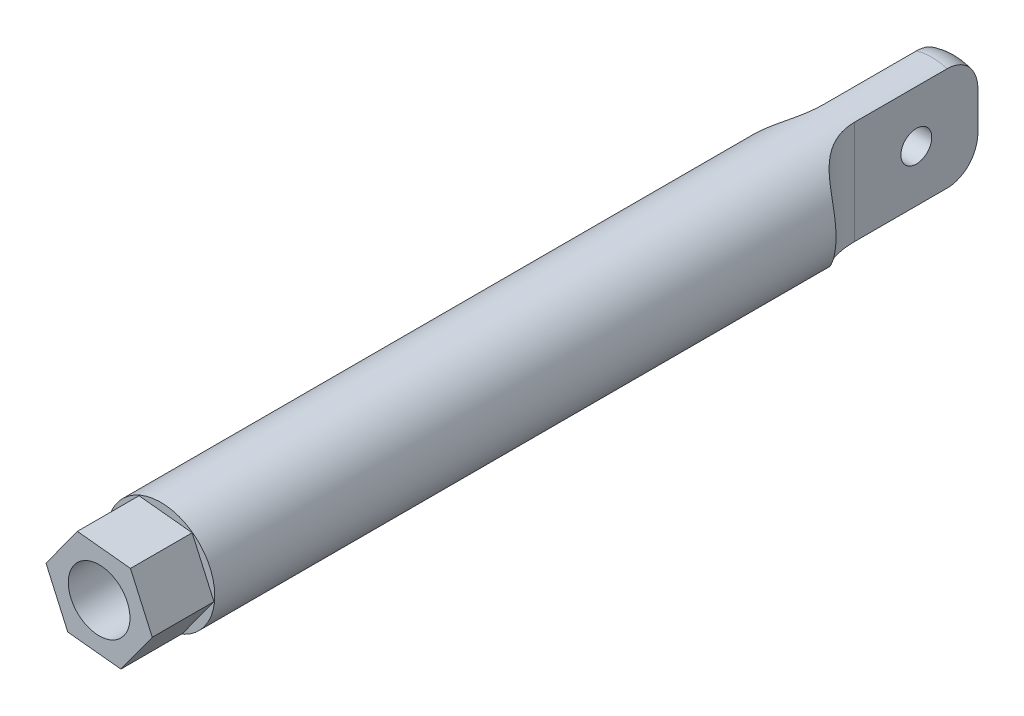
ISO-10303-21;
HEADER;
FILE_DESCRIPTION(('STEP AP214'),'2;1');
FILE_NAME('part.step','',(''),(''),'','','');
FILE_SCHEMA(('AUTOMOTIVE_DESIGN { 1 0 10303 214 1 1 1 1 }'));
ENDSEC;
DATA;
#1=APPLICATION_CONTEXT('core data for automotive mechanical design processes');
#2=APPLICATION_PROTOCOL_DEFINITION('international standard','automotive_design',2000,#1);
#3=PRODUCT_CONTEXT('',#1,'mechanical');
#4=PRODUCT('Part','Part','',(#3));
#5=PRODUCT_RELATED_PRODUCT_CATEGORY('part','',(#4));
#6=PRODUCT_DEFINITION_FORMATION('','',#4);
#7=PRODUCT_DEFINITION_CONTEXT('part definition',#1,'design');
#8=PRODUCT_DEFINITION('design','',#6,#7);
#9=PRODUCT_DEFINITION_SHAPE('','',#8);
#10=(LENGTH_UNIT() NAMED_UNIT(*) SI_UNIT(.MILLI.,.METRE.));
#11=(NAMED_UNIT(*) PLANE_ANGLE_UNIT() SI_UNIT($,.RADIAN.));
#12=(NAMED_UNIT(*) SI_UNIT($,.STERADIAN.) SOLID_ANGLE_UNIT());
#13=UNCERTAINTY_MEASURE_WITH_UNIT(LENGTH_MEASURE(1.E-05),#10,'distance_accuracy_value','');
#14=(GEOMETRIC_REPRESENTATION_CONTEXT(3) GLOBAL_UNCERTAINTY_ASSIGNED_CONTEXT((#13)) GLOBAL_UNIT_ASSIGNED_CONTEXT((#10,
#11,#12)) REPRESENTATION_CONTEXT('',''));
#15=CARTESIAN_POINT('',(0.,0.,0.));
#16=DIRECTION('',(0.,0.,1.));
#17=DIRECTION('',(1.,0.,0.));
#18=AXIS2_PLACEMENT_3D('',#15,#16,#17);
#19=CARTESIAN_POINT('',(0.,0.,20.));
#20=DIRECTION('',(0.,0.,-1.));
#21=DIRECTION('',(-1.,0.,0.));
#22=AXIS2_PLACEMENT_3D('',#19,#20,#21);
#23=CYLINDRICAL_SURFACE('',#22,1.75);
#24=CARTESIAN_POINT('',(0.,0.,20.));
#25=DIRECTION('',(0.,0.,1.));
#26=DIRECTION('',(1.,0.,0.));
#27=AXIS2_PLACEMENT_3D('',#24,#25,#26);
#28=CIRCLE('',#27,1.75);
#29=CARTESIAN_POINT('',(1.75,0.,20.));
#30=VERTEX_POINT('',#29);
#31=EDGE_CURVE('E180',#30,#30,#28,.T.);
#32=ORIENTED_EDGE('',*,*,#31,.F.);
#33=EDGE_LOOP('',(#32));
#34=FACE_BOUND('',#33,.T.);
#35=DIRECTION('',(0.,0.,1.));
#36=VECTOR('',#35,1.);
#37=CARTESIAN_POINT('',(-0.5,-1.67705098312484,-6.));
#38=LINE('',#37,#36);
#39=CARTESIAN_POINT('',(-0.5,-1.67705098312484,-5.));
#40=VERTEX_POINT('',#39);
#41=CARTESIAN_POINT('',(-0.5,-1.67705098312484,-2.));
#42=VERTEX_POINT('',#41);
#43=EDGE_CURVE('E184',#40,#42,#38,.T.);
#44=ORIENTED_EDGE('',*,*,#43,.F.);
#45=CARTESIAN_POINT('',(0.,0.,-5.));
#46=DIRECTION('',(0.,0.,-1.));
#47=DIRECTION('',(-1.,0.,0.));
#48=AXIS2_PLACEMENT_3D('',#45,#46,#47);
#49=CIRCLE('',#48,1.75);
#50=CARTESIAN_POINT('',(0.5,-1.67705098312484,-5.));
#51=VERTEX_POINT('',#50);
#52=EDGE_CURVE('E75',#40,#51,#49,.F.);
#53=ORIENTED_EDGE('',*,*,#52,.T.);
#54=DIRECTION('',(0.,0.,1.));
#55=VECTOR('',#54,1.);
#56=CARTESIAN_POINT('',(0.5,-1.67705098312484,-6.));
#57=LINE('',#56,#55);
#58=CARTESIAN_POINT('',(0.5,-1.67705098312484,-2.));
#59=VERTEX_POINT('',#58);
#60=EDGE_CURVE('E179',#51,#59,#57,.T.);
#61=ORIENTED_EDGE('',*,*,#60,.T.);
#62=CARTESIAN_POINT('',(0.5,-1.67705098312484,-2.));
#63=CARTESIAN_POINT('',(0.499994368760104,-1.6770354956341,-1.94779850562818));
#64=CARTESIAN_POINT('',(0.502043786255566,-1.67644117921669,-1.89559753960627));
#65=CARTESIAN_POINT('',(0.510210741401807,-1.6739827907674,-1.79153500315001));
#66=CARTESIAN_POINT('',(0.516329067705572,-1.67211847257675,-1.73967350048015));
#67=CARTESIAN_POINT('',(0.532626936385553,-1.66699687056864,-1.63642635701448));
#68=CARTESIAN_POINT('',(0.542823897447035,-1.66373360791191,-1.585043737132));
#69=CARTESIAN_POINT('',(0.567169530888582,-1.65559080971641,-1.48337219697433));
#70=CARTESIAN_POINT('',(0.581317980893425,-1.65071136512752,-1.43308321532482));
#71=CARTESIAN_POINT('',(0.629582184733351,-1.63319521188351,-1.28417787664913));
#72=CARTESIAN_POINT('',(0.669493017112604,-1.61768640895561,-1.18767195511259));
#73=CARTESIAN_POINT('',(0.762581856820665,-1.57592622715432,-1.00403868638829));
#74=CARTESIAN_POINT('',(0.815729226293232,-1.54969956767906,-0.916890337305117));
#75=CARTESIAN_POINT('',(0.92711808993018,-1.48551241329525,-0.761254059595936));
#76=CARTESIAN_POINT('',(0.984670484617635,-1.44858916291394,-0.691853392475164));
#77=CARTESIAN_POINT('',(1.10307852981525,-1.36055735206579,-0.566104628248389));
#78=CARTESIAN_POINT('',(1.16393049264598,-1.30946437547285,-0.509742315744062));
#79=CARTESIAN_POINT('',(1.27463269084449,-1.20122198654888,-0.417937641428869));
#80=CARTESIAN_POINT('',(1.32482028315847,-1.14595583221622,-0.380662815132576));
#81=CARTESIAN_POINT('',(1.41981408952918,-1.02590561759596,-0.315804849468108));
#82=CARTESIAN_POINT('',(1.46461876878428,-0.961118854397993,-0.288224469930275));
#83=CARTESIAN_POINT('',(1.54482406578528,-0.825850281714614,-0.242239046746777));
#84=CARTESIAN_POINT('',(1.58046132268212,-0.755590346619209,-0.223589328779858));
#85=CARTESIAN_POINT('',(1.64227010096167,-0.609694301766643,-0.192932414466813));
#86=CARTESIAN_POINT('',(1.66844247834643,-0.534058678926419,-0.18092461737448));
#87=CARTESIAN_POINT('',(1.7093649040377,-0.382690513207061,-0.162780526718146));
#88=CARTESIAN_POINT('',(1.72456317988895,-0.307105951910005,-0.156411079550968));
#89=CARTESIAN_POINT('',(1.74488277767862,-0.154353416992535,-0.147996366695973));
#90=CARTESIAN_POINT('',(1.75000191284764,-0.0771851034300754,-0.145952039378574));
#91=CARTESIAN_POINT('',(1.74999780045129,0.0887537466603745,-0.145948468096598));
#92=CARTESIAN_POINT('',(1.74322440688529,0.177529693356911,-0.148647428740008));
#93=CARTESIAN_POINT('',(1.71637710716438,0.352713049713646,-0.159852537199496));
#94=CARTESIAN_POINT('',(1.69629729938487,0.43911939069674,-0.168361261797137));
#95=CARTESIAN_POINT('',(1.64363349655238,0.60723728009681,-0.192384662048259));
#96=CARTESIAN_POINT('',(1.61102414659559,0.688938920017352,-0.20791355510727));
#97=CARTESIAN_POINT('',(1.53500808753283,0.844841115620229,-0.247681905645829));
#98=CARTESIAN_POINT('',(1.49160842487803,0.91904652230522,-0.271915683107096));
#99=CARTESIAN_POINT('',(1.39864086033547,1.05490115063262,-0.329708579575449));
#100=CARTESIAN_POINT('',(1.34937461732014,1.11692368829345,-0.362872925986087));
#101=CARTESIAN_POINT('',(1.24697649709225,1.2301938824324,-0.43986698868439));
#102=CARTESIAN_POINT('',(1.19384645814268,1.28144661825437,-0.483691656124972));
#103=CARTESIAN_POINT('',(1.09104439951398,1.3698342474073,-0.578928156800576));
#104=CARTESIAN_POINT('',(1.04136107424774,1.40764457907203,-0.629705891103311));
#105=CARTESIAN_POINT('',(0.945288575693474,1.47388681455344,-0.739758104881316));
#106=CARTESIAN_POINT('',(0.898900251817218,1.50231630693835,-0.799034763475127));
#107=CARTESIAN_POINT('',(0.810061105244946,1.55209958243672,-0.927405132603375));
#108=CARTESIAN_POINT('',(0.767864591295967,1.57309747597833,-0.996810911116874));
#109=CARTESIAN_POINT('',(0.691690417619834,1.60804998747918,-1.14167108282463));
#110=CARTESIAN_POINT('',(0.657719965290688,1.62199844050285,-1.21713070369136));
#111=CARTESIAN_POINT('',(0.595217433162131,1.64605425240302,-1.38299400372385));
#112=CARTESIAN_POINT('',(0.568064668084726,1.65537531544644,-1.47403000988998));
#113=CARTESIAN_POINT('',(0.526949208013219,1.66892079092357,-1.65931931681658));
#114=CARTESIAN_POINT('',(0.51297225282159,1.67315071488033,-1.75356902459996));
#115=CARTESIAN_POINT('',(0.503841035168636,1.67590085139054,-1.87353036390101));
#116=CARTESIAN_POINT('',(0.502399877054088,1.67633345115781,-1.89882132691853));
#117=CARTESIAN_POINT('',(0.500480538421314,1.67690839350984,-1.94940570526943));
#118=CARTESIAN_POINT('',(0.50000093999845,1.67705116347812,-1.97469906190988));
#119=CARTESIAN_POINT('',(0.5,1.67705098312484,-2.));
#120=B_SPLINE_CURVE_WITH_KNOTS('',3,(#62,#63,#64,#65,#66,#67,#68,#69,#70,#71,#72,#73,#74,#75,
#76,#77,#78,#79,#80,#81,#82,#83,#84,#85,#86,#87,#88,#89,#90,#91,#92,#93,#94,#95,#96,#97,#98,#99,
#100,#101,#102,#103,#104,#105,#106,#107,#108,#109,#110,#111,#112,#113,#114,#115,#116,#117,#118,
#119),.UNSPECIFIED.,.F.,.F.,(4,2,2,2,2,2,2,2,2,2,2,2,2,2,2,2,2,2,2,2,2,2,2,2,2,2,2,2,4),(0.,
0.156559424932146,0.31314920371672,0.470414997749555,0.627671943226262,0.942632539499827,
1.25687078175179,1.54734717332285,1.83750535708071,2.08655984327701,2.33568517338147,
2.57752712946928,2.81934720793962,3.05062481360145,3.2819525917036,3.54795219655979,
3.81406985586601,4.08072889403875,4.34721424983615,4.60344405257125,4.85955273748294,
5.0998765655702,5.34026212308676,5.59096071927434,5.84187818075049,6.12711457922296,
6.41204191030366,6.48803673525265,6.56391941646192),.UNSPECIFIED.);
#121=CARTESIAN_POINT('',(0.5,1.67705098312484,-2.));
#122=VERTEX_POINT('',#121);
#123=EDGE_CURVE('E50',#59,#122,#120,.T.);
#124=ORIENTED_EDGE('',*,*,#123,.T.);
#125=DIRECTION('',(0.,0.,1.));
#126=VECTOR('',#125,1.);
#127=CARTESIAN_POINT('',(0.5,1.67705098312484,-6.));
#128=LINE('',#127,#126);
#129=CARTESIAN_POINT('',(0.5,1.67705098312484,-5.));
#130=VERTEX_POINT('',#129);
#131=EDGE_CURVE('E193',#130,#122,#128,.T.);
#132=ORIENTED_EDGE('',*,*,#131,.F.);
#133=CARTESIAN_POINT('',(0.,0.,-5.));
#134=DIRECTION('',(0.,0.,-1.));
#135=DIRECTION('',(-1.,0.,0.));
#136=AXIS2_PLACEMENT_3D('',#133,#134,#135);
#137=CIRCLE('',#136,1.75);
#138=CARTESIAN_POINT('',(-0.499999999999999,1.67705098312484,-5.));
#139=VERTEX_POINT('',#138);
#140=EDGE_CURVE('E265',#130,#139,#137,.F.);
#141=ORIENTED_EDGE('',*,*,#140,.T.);
#142=DIRECTION('',(0.,0.,1.));
#143=VECTOR('',#142,1.);
#144=CARTESIAN_POINT('',(-0.499999999999999,1.67705098312484,-6.));
#145=LINE('',#144,#143);
#146=CARTESIAN_POINT('',(-0.5,1.67705098312484,-2.));
#147=VERTEX_POINT('',#146);
#148=EDGE_CURVE('E190',#139,#147,#145,.T.);
#149=ORIENTED_EDGE('',*,*,#148,.T.);
#150=CARTESIAN_POINT('',(-0.5,1.67705098312484,-2.));
#151=CARTESIAN_POINT('',(-0.499994368760104,1.6770354956341,-1.94779850562818));
#152=CARTESIAN_POINT('',(-0.502043786255566,1.67644117921669,-1.89559753960627));
#153=CARTESIAN_POINT('',(-0.510210741401807,1.6739827907674,-1.79153500315001));
#154=CARTESIAN_POINT('',(-0.516329067705572,1.67211847257675,-1.73967350048015));
#155=CARTESIAN_POINT('',(-0.532626936385553,1.66699687056864,-1.63642635701448));
#156=CARTESIAN_POINT('',(-0.542823897447035,1.66373360791191,-1.585043737132));
#157=CARTESIAN_POINT('',(-0.567169530888582,1.65559080971641,-1.48337219697433));
#158=CARTESIAN_POINT('',(-0.581317980893425,1.65071136512752,-1.43308321532482));
#159=CARTESIAN_POINT('',(-0.629582184733351,1.63319521188351,-1.28417787664913));
#160=CARTESIAN_POINT('',(-0.669493017112604,1.61768640895561,-1.18767195511259));
#161=CARTESIAN_POINT('',(-0.762581856820665,1.57592622715432,-1.00403868638829));
#162=CARTESIAN_POINT('',(-0.815729226293232,1.54969956767906,-0.916890337305117));
#163=CARTESIAN_POINT('',(-0.92711808993018,1.48551241329525,-0.761254059595936));
#164=CARTESIAN_POINT('',(-0.984670484617635,1.44858916291394,-0.691853392475164));
#165=CARTESIAN_POINT('',(-1.10307852981525,1.36055735206579,-0.566104628248389));
#166=CARTESIAN_POINT('',(-1.16393049264598,1.30946437547285,-0.509742315744062));
#167=CARTESIAN_POINT('',(-1.27463269084449,1.20122198654888,-0.417937641428869));
#168=CARTESIAN_POINT('',(-1.32482028315847,1.14595583221622,-0.380662815132576));
#169=CARTESIAN_POINT('',(-1.41981408952918,1.02590561759596,-0.315804849468108));
#170=CARTESIAN_POINT('',(-1.46461876878428,0.961118854397993,-0.288224469930275));
#171=CARTESIAN_POINT('',(-1.54482406578528,0.825850281714614,-0.242239046746777));
#172=CARTESIAN_POINT('',(-1.58046132268212,0.755590346619209,-0.223589328779858));
#173=CARTESIAN_POINT('',(-1.64227010096167,0.609694301766643,-0.192932414466813));
#174=CARTESIAN_POINT('',(-1.66844247834643,0.534058678926419,-0.18092461737448));
#175=CARTESIAN_POINT('',(-1.7093649040377,0.382690513207061,-0.162780526718146));
#176=CARTESIAN_POINT('',(-1.72456317988895,0.307105951910005,-0.156411079550968));
#177=CARTESIAN_POINT('',(-1.74488277767862,0.154353416992535,-0.147996366695973));
#178=CARTESIAN_POINT('',(-1.75000191284764,0.0771851034300755,-0.145952039378574));
#179=CARTESIAN_POINT('',(-1.74999780045129,-0.0887537466603742,-0.145948468096598));
#180=CARTESIAN_POINT('',(-1.74322440688529,-0.177529693356911,-0.148647428740008));
#181=CARTESIAN_POINT('',(-1.71637710716438,-0.352713049713646,-0.159852537199496));
#182=CARTESIAN_POINT('',(-1.69629729938487,-0.43911939069674,-0.168361261797137));
#183=CARTESIAN_POINT('',(-1.64363349655238,-0.60723728009681,-0.192384662048259));
#184=CARTESIAN_POINT('',(-1.61102414659559,-0.688938920017352,-0.20791355510727));
#185=CARTESIAN_POINT('',(-1.53500808753283,-0.844841115620229,-0.247681905645829));
#186=CARTESIAN_POINT('',(-1.49160842487803,-0.91904652230522,-0.271915683107097));
#187=CARTESIAN_POINT('',(-1.39864086033547,-1.05490115063262,-0.329708579575449));
#188=CARTESIAN_POINT('',(-1.34937461732014,-1.11692368829345,-0.362872925986087));
#189=CARTESIAN_POINT('',(-1.24697649709225,-1.2301938824324,-0.43986698868439));
#190=CARTESIAN_POINT('',(-1.19384645814268,-1.28144661825437,-0.483691656124972));
#191=CARTESIAN_POINT('',(-1.09104439951398,-1.3698342474073,-0.578928156800576));
#192=CARTESIAN_POINT('',(-1.04136107424774,-1.40764457907203,-0.629705891103311));
#193=CARTESIAN_POINT('',(-0.945288575693474,-1.47388681455344,-0.739758104881316));
#194=CARTESIAN_POINT('',(-0.898900251817219,-1.50231630693835,-0.799034763475127));
#195=CARTESIAN_POINT('',(-0.810061105244946,-1.55209958243672,-0.927405132603375));
#196=CARTESIAN_POINT('',(-0.767864591295967,-1.57309747597833,-0.996810911116873));
#197=CARTESIAN_POINT('',(-0.691690417619834,-1.60804998747918,-1.14167108282463));
#198=CARTESIAN_POINT('',(-0.657719965290688,-1.62199844050285,-1.21713070369136));
#199=CARTESIAN_POINT('',(-0.595217433162131,-1.64605425240302,-1.38299400372385));
#200=CARTESIAN_POINT('',(-0.568064668084726,-1.65537531544644,-1.47403000988998));
#201=CARTESIAN_POINT('',(-0.526949208013218,-1.66892079092357,-1.65931931681658));
#202=CARTESIAN_POINT('',(-0.51297225282159,-1.67315071488033,-1.75356902459996));
#203=CARTESIAN_POINT('',(-0.503841035168636,-1.67590085139054,-1.87353036390101));
#204=CARTESIAN_POINT('',(-0.502399877054088,-1.67633345115781,-1.89882132691853));
#205=CARTESIAN_POINT('',(-0.500480538421314,-1.67690839350984,-1.94940570526943));
#206=CARTESIAN_POINT('',(-0.50000093999845,-1.67705116347812,-1.97469906190988));
#207=CARTESIAN_POINT('',(-0.499999999999999,-1.67705098312484,-2.));
#208=B_SPLINE_CURVE_WITH_KNOTS('',3,(#150,#151,#152,#153,#154,#155,#156,#157,#158,#159,#160,
#161,#162,#163,#164,#165,#166,#167,#168,#169,#170,#171,#172,#173,#174,#175,#176,#177,#178,#179,
#180,#181,#182,#183,#184,#185,#186,#187,#188,#189,#190,#191,#192,#193,#194,#195,#196,#197,#198,
#199,#200,#201,#202,#203,#204,#205,#206,#207),.UNSPECIFIED.,.F.,.F.,(4,2,2,2,2,2,2,2,2,2,2,2,2,
2,2,2,2,2,2,2,2,2,2,2,2,2,2,2,4),(0.,0.156559424932146,0.31314920371672,0.470414997749555,
0.627671943226262,0.942632539499827,1.25687078175179,1.54734717332285,1.83750535708071,
2.08655984327701,2.33568517338147,2.57752712946928,2.81934720793962,3.05062481360145,
3.2819525917036,3.54795219655979,3.81406985586601,4.08072889403875,4.34721424983615,
4.60344405257125,4.85955273748294,5.0998765655702,5.34026212308676,5.59096071927434,
5.84187818075049,6.12711457922296,6.41204191030366,6.48803673525265,6.56391941646192),.UNSPECIFIED.);
#209=EDGE_CURVE('E11',#147,#42,#208,.T.);
#210=ORIENTED_EDGE('',*,*,#209,.T.);
#211=EDGE_LOOP('',(#44,#53,#61,#124,#132,#141,#149,#210));
#212=FACE_BOUND('',#211,.T.);
#213=ADVANCED_FACE('F36',(#34,#212),#23,.T.);
#214=CARTESIAN_POINT('',(0.,0.,20.));
#215=DIRECTION('',(0.,0.,1.));
#216=DIRECTION('',(1.,0.,0.));
#217=AXIS2_PLACEMENT_3D('',#214,#215,#216);
#218=PLANE('',#217);
#219=DIRECTION('',(0.587086788703137,0.809523997501147,0.));
#220=VECTOR('',#219,1.);
#221=CARTESIAN_POINT('',(0.705853923008576,-1.58169852986383,20.));
#222=LINE('',#221,#220);
#223=CARTESIAN_POINT('',(0.705853923008576,-1.58169852986383,20.));
#224=VERTEX_POINT('',#223);
#225=CARTESIAN_POINT('',(1.72271806949487,-0.179561836245582,20.));
#226=VERTEX_POINT('',#225);
#227=EDGE_CURVE('E458',#224,#226,#222,.T.);
#228=ORIENTED_EDGE('',*,*,#227,.F.);
#229=DIRECTION('',(0.994611741160693,-0.10367007449257,0.));
#230=VECTOR('',#229,1.);
#231=CARTESIAN_POINT('',(-1.01686414648629,-1.40213669361825,20.));
#232=LINE('',#231,#230);
#233=CARTESIAN_POINT('',(-1.01686414648629,-1.40213669361825,20.));
#234=VERTEX_POINT('',#233);
#235=EDGE_CURVE('E160',#234,#224,#232,.T.);
#236=ORIENTED_EDGE('',*,*,#235,.F.);
#237=DIRECTION('',(0.407524952457555,-0.913194071993718,0.));
#238=VECTOR('',#237,1.);
#239=CARTESIAN_POINT('',(-1.72271806949487,0.179561836245582,20.));
#240=LINE('',#239,#238);
#241=CARTESIAN_POINT('',(-1.72271806949487,0.179561836245582,20.));
#242=VERTEX_POINT('',#241);
#243=EDGE_CURVE('E156',#242,#234,#240,.T.);
#244=ORIENTED_EDGE('',*,*,#243,.F.);
#245=DIRECTION('',(-0.587086788703137,-0.809523997501148,0.));
#246=VECTOR('',#245,1.);
#247=CARTESIAN_POINT('',(-0.705853923008577,1.58169852986383,20.));
#248=LINE('',#247,#246);
#249=CARTESIAN_POINT('',(-0.705853923008577,1.58169852986383,20.));
#250=VERTEX_POINT('',#249);
#251=EDGE_CURVE('E468',#250,#242,#248,.T.);
#252=ORIENTED_EDGE('',*,*,#251,.F.);
#253=DIRECTION('',(-0.994611741160693,0.10367007449257,0.));
#254=VECTOR('',#253,1.);
#255=CARTESIAN_POINT('',(1.01686414648629,1.40213669361825,20.));
#256=LINE('',#255,#254);
#257=CARTESIAN_POINT('',(1.01686414648629,1.40213669361825,20.));
#258=VERTEX_POINT('',#257);
#259=EDGE_CURVE('E457',#258,#250,#256,.T.);
#260=ORIENTED_EDGE('',*,*,#259,.F.);
#261=DIRECTION('',(-0.407524952457556,0.913194071993718,0.));
#262=VECTOR('',#261,1.);
#263=CARTESIAN_POINT('',(1.72271806949487,-0.179561836245582,20.));
#264=LINE('',#263,#262);
#265=EDGE_CURVE('E453',#226,#258,#264,.T.);
#266=ORIENTED_EDGE('',*,*,#265,.F.);
#267=EDGE_LOOP('',(#228,#236,#244,#252,#260,#266));
#268=FACE_BOUND('',#267,.T.);
#269=ORIENTED_EDGE('',*,*,#31,.T.);
#270=EDGE_LOOP('',(#269));
#271=FACE_BOUND('',#270,.T.);
#272=ADVANCED_FACE('F220',(#268,#271),#218,.T.);
#273=CARTESIAN_POINT('',(-0.5,1.67705098312484,-6.));
#274=DIRECTION('',(1.,0.,0.));
#275=DIRECTION('',(0.,0.,-1.));
#276=AXIS2_PLACEMENT_3D('',#273,#274,#275);
#277=PLANE('',#276);
#278=CARTESIAN_POINT('',(-0.5,0.,-4.));
#279=DIRECTION('',(1.,0.,0.));
#280=DIRECTION('',(0.,0.,-1.));
#281=AXIS2_PLACEMENT_3D('',#278,#279,#280);
#282=CIRCLE('',#281,0.5);
#283=CARTESIAN_POINT('',(-0.5,0.,-4.5));
#284=VERTEX_POINT('',#283);
#285=EDGE_CURVE('E165',#284,#284,#282,.T.);
#286=ORIENTED_EDGE('',*,*,#285,.T.);
#287=EDGE_LOOP('',(#286));
#288=FACE_BOUND('',#287,.T.);
#289=ORIENTED_EDGE('',*,*,#43,.T.);
#290=DIRECTION('',(0.,1.,0.));
#291=VECTOR('',#290,1.);
#292=CARTESIAN_POINT('',(-0.5,1.67705098312484,-2.));
#293=LINE('',#292,#291);
#294=EDGE_CURVE('E238',#42,#147,#293,.T.);
#295=ORIENTED_EDGE('',*,*,#294,.T.);
#296=ORIENTED_EDGE('',*,*,#148,.F.);
#297=CARTESIAN_POINT('',(-0.499999999999999,1.67705098312484,-5.));
#298=CARTESIAN_POINT('',(-0.5,1.67705105514918,-5.02712221675765));
#299=CARTESIAN_POINT('',(-0.5,1.67589881450192,-5.05423130306363));
#300=CARTESIAN_POINT('',(-0.5,1.67130383903263,-5.10825230592725));
#301=CARTESIAN_POINT('',(-0.5,1.6678613008873,-5.13516423921458));
#302=CARTESIAN_POINT('',(-0.5,1.65414165250946,-5.2152235947678));
#303=CARTESIAN_POINT('',(-0.5,1.64047234325635,-5.26782954038159));
#304=CARTESIAN_POINT('',(-0.5,1.60450833746373,-5.36998873193024));
#305=CARTESIAN_POINT('',(-0.5,1.58221113848202,-5.41954108736036));
#306=CARTESIAN_POINT('',(-0.5,1.52968242645123,-5.51425796582973));
#307=CARTESIAN_POINT('',(-0.5,1.49944949912221,-5.55942170477607));
#308=CARTESIAN_POINT('',(-0.5,1.43166003567242,-5.64456928803723));
#309=CARTESIAN_POINT('',(-0.5,1.39403638843814,-5.684499609823));
#310=CARTESIAN_POINT('',(-0.5,1.31282823180818,-5.75768858177214));
#311=CARTESIAN_POINT('',(-0.5,1.26924659166248,-5.79095042443848));
#312=CARTESIAN_POINT('',(-0.5,1.17590617534478,-5.8511338045389));
#313=CARTESIAN_POINT('',(-0.5,1.1259929953532,-5.8778149614399));
#314=CARTESIAN_POINT('',(-0.5,1.02253057080096,-5.92312201997402));
#315=CARTESIAN_POINT('',(-0.5,0.968974440489841,-5.94173214744525));
#316=CARTESIAN_POINT('',(-0.5,0.885429793156453,-5.96413279272261));
#317=CARTESIAN_POINT('',(-0.5,0.856167447071508,-5.97078029204757));
#318=CARTESIAN_POINT('',(-0.5,0.797223172545375,-5.98194478378622));
#319=CARTESIAN_POINT('',(-0.5,0.7675410848163,-5.98646094374436));
#320=CARTESIAN_POINT('',(-0.5,0.70808151016266,-5.99348074467713));
#321=CARTESIAN_POINT('',(-0.5,0.678305030017304,-5.99599322157477));
#322=CARTESIAN_POINT('',(-0.5,0.618686576752835,-5.99925816773273));
#323=CARTESIAN_POINT('',(-0.5,0.588844712631542,-6.00001258234323));
#324=CARTESIAN_POINT('',(-0.5,0.559016994374948,-6.));
#325=B_SPLINE_CURVE_WITH_KNOTS('',3,(#297,#298,#299,#300,#301,#302,#303,#304,#305,#306,#307,
#308,#309,#310,#311,#312,#313,#314,#315,#316,#317,#318,#319,#320,#321,#322,#323,#324),
.UNSPECIFIED.,.F.,.F.,(4,2,2,2,2,2,2,2,2,2,2,2,2,4),(0.,0.0813161732522054,0.162625364471296,
0.324844050045972,0.487109821007945,0.649404530110584,0.813247420871931,0.977011684322015,
1.14608263644568,1.3154825508234,1.40543948553437,1.49543152647952,1.58502448782152,
1.67451826461537),.UNSPECIFIED.);
#326=CARTESIAN_POINT('',(-0.5,0.559016994374948,-6.));
#327=VERTEX_POINT('',#326);
#328=EDGE_CURVE('E197',#139,#327,#325,.T.);
#329=ORIENTED_EDGE('',*,*,#328,.T.);
#330=DIRECTION('',(0.,1.,0.));
#331=VECTOR('',#330,1.);
#332=CARTESIAN_POINT('',(-0.5,1.67705098312484,-6.));
#333=LINE('',#332,#331);
#334=CARTESIAN_POINT('',(-0.5,-0.559016994374947,-6.));
#335=VERTEX_POINT('',#334);
#336=EDGE_CURVE('E173',#335,#327,#333,.T.);
#337=ORIENTED_EDGE('',*,*,#336,.F.);
#338=CARTESIAN_POINT('',(-0.5,-0.559016994374948,-6.));
#339=CARTESIAN_POINT('',(-0.5,-0.590523370220473,-6.0000155087921));
#340=CARTESIAN_POINT('',(-0.5,-0.622047209207892,-5.99917221406143));
#341=CARTESIAN_POINT('',(-0.5,-0.685017542584036,-5.99551160620083));
#342=CARTESIAN_POINT('',(-0.5,-0.716463887666625,-5.99269178450116));
#343=CARTESIAN_POINT('',(-0.5,-0.779238988183232,-5.98480115354807));
#344=CARTESIAN_POINT('',(-0.5,-0.810566419238076,-5.979719417905));
#345=CARTESIAN_POINT('',(-0.5,-0.872715817030011,-5.96715294432306));
#346=CARTESIAN_POINT('',(-0.5,-0.903538003746205,-5.95966928303451));
#347=CARTESIAN_POINT('',(-0.5,-0.991578636703342,-5.93440466173859));
#348=CARTESIAN_POINT('',(-0.5,-1.04791620546273,-5.91338259910433));
#349=CARTESIAN_POINT('',(-0.5,-1.15618485880326,-5.86227735730488));
#350=CARTESIAN_POINT('',(-0.5,-1.20812498707792,-5.83221338373551));
#351=CARTESIAN_POINT('',(-0.5,-1.30620398582002,-5.76335081830182));
#352=CARTESIAN_POINT('',(-0.5,-1.35231828406257,-5.72451703718384));
#353=CARTESIAN_POINT('',(-0.5,-1.43685094592269,-5.63914846526164));
#354=CARTESIAN_POINT('',(-0.5,-1.47526451057295,-5.59260890512398));
#355=CARTESIAN_POINT('',(-0.5,-1.54077647896141,-5.49643155279105));
#356=CARTESIAN_POINT('',(-0.5,-1.56843639771522,-5.44717522253561));
#357=CARTESIAN_POINT('',(-0.5,-1.61476960827332,-5.34462967273246));
#358=CARTESIAN_POINT('',(-0.5,-1.63345117457977,-5.2913442190781));
#359=CARTESIAN_POINT('',(-0.5,-1.65718931163361,-5.19818965111167));
#360=CARTESIAN_POINT('',(-0.5,-1.66462580305358,-5.15890980002616));
#361=CARTESIAN_POINT('',(-0.5,-1.67455993536413,-5.07975962250253));
#362=CARTESIAN_POINT('',(-0.5,-1.67706112351549,-5.03988974093176));
#363=CARTESIAN_POINT('',(-0.5,-1.67705098312484,-5.));
#364=B_SPLINE_CURVE_WITH_KNOTS('',3,(#338,#339,#340,#341,#342,#343,#344,#345,#346,#347,#348,
#349,#350,#351,#352,#353,#354,#355,#356,#357,#358,#359,#360,#361,#362,#363),.UNSPECIFIED.,.F.,
.F.,(4,2,2,2,2,2,2,2,2,2,2,2,4),(0.,0.0945327228286313,0.189185642515109,0.284300839779262,
0.379373461570003,0.558924560141508,0.738096942324794,0.918001455223145,1.09801773542514,
1.26666172786712,1.43514999755029,1.55478924419672,1.67434246848618),.UNSPECIFIED.);
#365=EDGE_CURVE('E205',#335,#40,#364,.T.);
#366=ORIENTED_EDGE('',*,*,#365,.T.);
#367=EDGE_LOOP('',(#289,#295,#296,#329,#337,#366));
#368=FACE_BOUND('',#367,.T.);
#369=ADVANCED_FACE('F214',(#288,#368),#277,.F.);
#370=CARTESIAN_POINT('',(0.5,1.67705098312484,-6.));
#371=DIRECTION('',(-1.,0.,0.));
#372=DIRECTION('',(0.,0.,1.));
#373=AXIS2_PLACEMENT_3D('',#370,#371,#372);
#374=PLANE('',#373);
#375=CARTESIAN_POINT('',(0.5,0.,-4.));
#376=DIRECTION('',(-1.,0.,0.));
#377=DIRECTION('',(0.,0.,1.));
#378=AXIS2_PLACEMENT_3D('',#375,#376,#377);
#379=CIRCLE('',#378,0.5);
#380=CARTESIAN_POINT('',(0.5,0.,-3.5));
#381=VERTEX_POINT('',#380);
#382=EDGE_CURVE('E162',#381,#381,#379,.T.);
#383=ORIENTED_EDGE('',*,*,#382,.T.);
#384=EDGE_LOOP('',(#383));
#385=FACE_BOUND('',#384,.T.);
#386=ORIENTED_EDGE('',*,*,#131,.T.);
#387=DIRECTION('',(0.,-1.,0.));
#388=VECTOR('',#387,1.);
#389=CARTESIAN_POINT('',(0.5,-1.67705098312484,-2.));
#390=LINE('',#389,#388);
#391=EDGE_CURVE('E248',#122,#59,#390,.T.);
#392=ORIENTED_EDGE('',*,*,#391,.T.);
#393=ORIENTED_EDGE('',*,*,#60,.F.);
#394=CARTESIAN_POINT('',(0.5,-1.67705098312484,-5.));
#395=CARTESIAN_POINT('',(0.5,-1.67705105514918,-5.02712221675765));
#396=CARTESIAN_POINT('',(0.5,-1.67589881450192,-5.05423130306363));
#397=CARTESIAN_POINT('',(0.5,-1.67130383903263,-5.10825230592725));
#398=CARTESIAN_POINT('',(0.5,-1.6678613008873,-5.13516423921458));
#399=CARTESIAN_POINT('',(0.5,-1.65414165250946,-5.2152235947678));
#400=CARTESIAN_POINT('',(0.5,-1.64047234325635,-5.26782954038159));
#401=CARTESIAN_POINT('',(0.5,-1.60450833746373,-5.36998873193024));
#402=CARTESIAN_POINT('',(0.5,-1.58221113848202,-5.41954108736036));
#403=CARTESIAN_POINT('',(0.5,-1.52968242645123,-5.51425796582973));
#404=CARTESIAN_POINT('',(0.5,-1.49944949912221,-5.55942170477607));
#405=CARTESIAN_POINT('',(0.5,-1.43166003567242,-5.64456928803723));
#406=CARTESIAN_POINT('',(0.5,-1.39403638843814,-5.684499609823));
#407=CARTESIAN_POINT('',(0.5,-1.31282823180818,-5.75768858177214));
#408=CARTESIAN_POINT('',(0.5,-1.26924659166248,-5.79095042443848));
#409=CARTESIAN_POINT('',(0.5,-1.17590617534478,-5.8511338045389));
#410=CARTESIAN_POINT('',(0.5,-1.1259929953532,-5.8778149614399));
#411=CARTESIAN_POINT('',(0.5,-1.02253057080096,-5.92312201997402));
#412=CARTESIAN_POINT('',(0.5,-0.968974440489841,-5.94173214744525));
#413=CARTESIAN_POINT('',(0.5,-0.885429793156453,-5.96413279272261));
#414=CARTESIAN_POINT('',(0.5,-0.856167447071508,-5.97078029204757));
#415=CARTESIAN_POINT('',(0.5,-0.797223172545375,-5.98194478378622));
#416=CARTESIAN_POINT('',(0.5,-0.7675410848163,-5.98646094374436));
#417=CARTESIAN_POINT('',(0.5,-0.70808151016266,-5.99348074467713));
#418=CARTESIAN_POINT('',(0.5,-0.678305030017304,-5.99599322157477));
#419=CARTESIAN_POINT('',(0.5,-0.618686576752835,-5.99925816773273));
#420=CARTESIAN_POINT('',(0.5,-0.588844712631542,-6.00001258234323));
#421=CARTESIAN_POINT('',(0.5,-0.559016994374948,-6.));
#422=B_SPLINE_CURVE_WITH_KNOTS('',3,(#394,#395,#396,#397,#398,#399,#400,#401,#402,#403,#404,
#405,#406,#407,#408,#409,#410,#411,#412,#413,#414,#415,#416,#417,#418,#419,#420,#421),
.UNSPECIFIED.,.F.,.F.,(4,2,2,2,2,2,2,2,2,2,2,2,2,4),(0.,0.0813161732522054,0.162625364471296,
0.324844050045972,0.487109821007945,0.649404530110584,0.813247420871931,0.977011684322015,
1.14608263644568,1.3154825508234,1.40543948553437,1.49543152647952,1.58502448782152,
1.67451826461537),.UNSPECIFIED.);
#423=CARTESIAN_POINT('',(0.5,-0.559016994374947,-6.));
#424=VERTEX_POINT('',#423);
#425=EDGE_CURVE('E251',#51,#424,#422,.T.);
#426=ORIENTED_EDGE('',*,*,#425,.T.);
#427=DIRECTION('',(0.,-1.,0.));
#428=VECTOR('',#427,1.);
#429=CARTESIAN_POINT('',(0.5,1.67705098312484,-6.));
#430=LINE('',#429,#428);
#431=CARTESIAN_POINT('',(0.5,0.559016994374948,-6.));
#432=VERTEX_POINT('',#431);
#433=EDGE_CURVE('E176',#432,#424,#430,.T.);
#434=ORIENTED_EDGE('',*,*,#433,.F.);
#435=CARTESIAN_POINT('',(0.5,0.559016994374948,-6.));
#436=CARTESIAN_POINT('',(0.5,0.590523370220473,-6.0000155087921));
#437=CARTESIAN_POINT('',(0.5,0.622047209207892,-5.99917221406143));
#438=CARTESIAN_POINT('',(0.5,0.685017542584036,-5.99551160620083));
#439=CARTESIAN_POINT('',(0.5,0.716463887666625,-5.99269178450116));
#440=CARTESIAN_POINT('',(0.5,0.779238988183232,-5.98480115354807));
#441=CARTESIAN_POINT('',(0.5,0.810566419238076,-5.979719417905));
#442=CARTESIAN_POINT('',(0.5,0.872715817030011,-5.96715294432306));
#443=CARTESIAN_POINT('',(0.5,0.903538003746205,-5.95966928303451));
#444=CARTESIAN_POINT('',(0.5,0.991578636703342,-5.93440466173859));
#445=CARTESIAN_POINT('',(0.5,1.04791620546273,-5.91338259910433));
#446=CARTESIAN_POINT('',(0.5,1.15618485880326,-5.86227735730488));
#447=CARTESIAN_POINT('',(0.5,1.20812498707792,-5.83221338373551));
#448=CARTESIAN_POINT('',(0.5,1.30620398582002,-5.76335081830182));
#449=CARTESIAN_POINT('',(0.5,1.35231828406257,-5.72451703718384));
#450=CARTESIAN_POINT('',(0.5,1.43685094592269,-5.63914846526164));
#451=CARTESIAN_POINT('',(0.5,1.47526451057295,-5.59260890512398));
#452=CARTESIAN_POINT('',(0.5,1.54077647896141,-5.49643155279105));
#453=CARTESIAN_POINT('',(0.5,1.56843639771522,-5.44717522253561));
#454=CARTESIAN_POINT('',(0.5,1.61476960827332,-5.34462967273246));
#455=CARTESIAN_POINT('',(0.5,1.63345117457977,-5.2913442190781));
#456=CARTESIAN_POINT('',(0.5,1.65718931163361,-5.19818965111167));
#457=CARTESIAN_POINT('',(0.5,1.66462580305358,-5.15890980002616));
#458=CARTESIAN_POINT('',(0.5,1.67455993536413,-5.07975962250253));
#459=CARTESIAN_POINT('',(0.5,1.67706112351549,-5.03988974093176));
#460=CARTESIAN_POINT('',(0.5,1.67705098312484,-5.));
#461=B_SPLINE_CURVE_WITH_KNOTS('',3,(#435,#436,#437,#438,#439,#440,#441,#442,#443,#444,#445,
#446,#447,#448,#449,#450,#451,#452,#453,#454,#455,#456,#457,#458,#459,#460),.UNSPECIFIED.,.F.,
.F.,(4,2,2,2,2,2,2,2,2,2,2,2,4),(0.,0.0945327228286313,0.189185642515109,0.284300839779262,
0.379373461570003,0.558924560141508,0.738096942324794,0.918001455223145,1.09801773542514,
1.26666172786712,1.43514999755029,1.55478924419672,1.67434246848618),.UNSPECIFIED.);
#462=EDGE_CURVE('E252',#432,#130,#461,.T.);
#463=ORIENTED_EDGE('',*,*,#462,.T.);
#464=EDGE_LOOP('',(#386,#392,#393,#426,#434,#463));
#465=FACE_BOUND('',#464,.T.);
#466=ADVANCED_FACE('F219',(#385,#465),#374,.F.);
#467=CARTESIAN_POINT('',(0.,0.,-6.));
#468=DIRECTION('',(0.,0.,-1.));
#469=DIRECTION('',(-1.,0.,0.));
#470=AXIS2_PLACEMENT_3D('',#467,#468,#469);
#471=PLANE('',#470);
#472=ORIENTED_EDGE('',*,*,#433,.T.);
#473=CARTESIAN_POINT('',(0.,0.,-6.));
#474=DIRECTION('',(0.,0.,-1.));
#475=DIRECTION('',(-1.,0.,0.));
#476=AXIS2_PLACEMENT_3D('',#473,#474,#475);
#477=CIRCLE('',#476,0.75);
#478=EDGE_CURVE('E194',#424,#335,#477,.T.);
#479=ORIENTED_EDGE('',*,*,#478,.T.);
#480=ORIENTED_EDGE('',*,*,#336,.T.);
#481=CARTESIAN_POINT('',(0.,0.,-6.));
#482=DIRECTION('',(0.,0.,-1.));
#483=DIRECTION('',(-1.,0.,0.));
#484=AXIS2_PLACEMENT_3D('',#481,#482,#483);
#485=CIRCLE('',#484,0.75);
#486=EDGE_CURVE('E183',#327,#432,#485,.T.);
#487=ORIENTED_EDGE('',*,*,#486,.T.);
#488=EDGE_LOOP('',(#472,#479,#480,#487));
#489=FACE_BOUND('',#488,.T.);
#490=ADVANCED_FACE('F277',(#489),#471,.T.);
#491=CARTESIAN_POINT('',(-1.750025,0.,-4.));
#492=DIRECTION('',(1.,0.,0.));
#493=DIRECTION('',(0.,0.,-1.));
#494=AXIS2_PLACEMENT_3D('',#491,#492,#493);
#495=CYLINDRICAL_SURFACE('',#494,0.5);
#496=ORIENTED_EDGE('',*,*,#382,.F.);
#497=EDGE_LOOP('',(#496));
#498=FACE_BOUND('',#497,.T.);
#499=ORIENTED_EDGE('',*,*,#285,.F.);
#500=EDGE_LOOP('',(#499));
#501=FACE_BOUND('',#500,.T.);
#502=ADVANCED_FACE('F303',(#498,#501),#495,.F.);
#503=CARTESIAN_POINT('',(0.,0.,22.));
#504=DIRECTION('',(0.,0.,1.));
#505=DIRECTION('',(1.,0.,0.));
#506=AXIS2_PLACEMENT_3D('',#503,#504,#505);
#507=PLANE('',#506);
#508=DIRECTION('',(0.994611741160693,-0.10367007449257,0.));
#509=VECTOR('',#508,1.);
#510=CARTESIAN_POINT('',(-1.01686414648629,-1.40213669361825,22.));
#511=LINE('',#510,#509);
#512=CARTESIAN_POINT('',(-1.01686414648629,-1.40213669361825,22.));
#513=VERTEX_POINT('',#512);
#514=CARTESIAN_POINT('',(0.705853923008576,-1.58169852986383,22.));
#515=VERTEX_POINT('',#514);
#516=EDGE_CURVE('E146',#513,#515,#511,.T.);
#517=ORIENTED_EDGE('',*,*,#516,.T.);
#518=DIRECTION('',(0.587086788703137,0.809523997501147,0.));
#519=VECTOR('',#518,1.);
#520=CARTESIAN_POINT('',(0.705853923008576,-1.58169852986383,22.));
#521=LINE('',#520,#519);
#522=CARTESIAN_POINT('',(1.72271806949487,-0.179561836245582,22.));
#523=VERTEX_POINT('',#522);
#524=EDGE_CURVE('E135',#515,#523,#521,.T.);
#525=ORIENTED_EDGE('',*,*,#524,.T.);
#526=DIRECTION('',(-0.407524952457556,0.913194071993718,0.));
#527=VECTOR('',#526,1.);
#528=CARTESIAN_POINT('',(1.72271806949487,-0.179561836245582,22.));
#529=LINE('',#528,#527);
#530=CARTESIAN_POINT('',(1.01686414648629,1.40213669361825,22.));
#531=VERTEX_POINT('',#530);
#532=EDGE_CURVE('E145',#523,#531,#529,.T.);
#533=ORIENTED_EDGE('',*,*,#532,.T.);
#534=DIRECTION('',(-0.994611741160693,0.10367007449257,0.));
#535=VECTOR('',#534,1.);
#536=CARTESIAN_POINT('',(1.01686414648629,1.40213669361825,22.));
#537=LINE('',#536,#535);
#538=CARTESIAN_POINT('',(-0.705853923008577,1.58169852986383,22.));
#539=VERTEX_POINT('',#538);
#540=EDGE_CURVE('E462',#531,#539,#537,.T.);
#541=ORIENTED_EDGE('',*,*,#540,.T.);
#542=DIRECTION('',(-0.587086788703137,-0.809523997501148,0.));
#543=VECTOR('',#542,1.);
#544=CARTESIAN_POINT('',(-0.705853923008577,1.58169852986383,22.));
#545=LINE('',#544,#543);
#546=CARTESIAN_POINT('',(-1.72271806949487,0.179561836245582,22.));
#547=VERTEX_POINT('',#546);
#548=EDGE_CURVE('E480',#539,#547,#545,.T.);
#549=ORIENTED_EDGE('',*,*,#548,.T.);
#550=DIRECTION('',(0.407524952457555,-0.913194071993718,0.));
#551=VECTOR('',#550,1.);
#552=CARTESIAN_POINT('',(-1.72271806949487,0.179561836245582,22.));
#553=LINE('',#552,#551);
#554=EDGE_CURVE('E152',#547,#513,#553,.T.);
#555=ORIENTED_EDGE('',*,*,#554,.T.);
#556=EDGE_LOOP('',(#517,#525,#533,#541,#549,#555));
#557=FACE_BOUND('',#556,.T.);
#558=CARTESIAN_POINT('',(0.,0.,22.));
#559=DIRECTION('',(0.,0.,1.));
#560=DIRECTION('',(1.,0.,0.));
#561=AXIS2_PLACEMENT_3D('',#558,#559,#560);
#562=CIRCLE('',#561,1.);
#563=CARTESIAN_POINT('',(1.,0.,22.));
#564=VERTEX_POINT('',#563);
#565=EDGE_CURVE('E486',#564,#564,#562,.T.);
#566=ORIENTED_EDGE('',*,*,#565,.F.);
#567=EDGE_LOOP('',(#566));
#568=FACE_BOUND('',#567,.T.);
#569=ADVANCED_FACE('F149',(#557,#568),#507,.T.);
#570=CARTESIAN_POINT('',(-1.01686414648629,-1.40213669361825,22.));
#571=DIRECTION('',(0.10367007449257,0.994611741160693,0.));
#572=DIRECTION('',(-0.994611741160693,0.10367007449257,0.));
#573=AXIS2_PLACEMENT_3D('',#570,#571,#572);
#574=PLANE('',#573);
#575=ORIENTED_EDGE('',*,*,#235,.T.);
#576=DIRECTION('',(0.,0.,-1.));
#577=VECTOR('',#576,1.);
#578=CARTESIAN_POINT('',(0.705853923008576,-1.58169852986383,22.));
#579=LINE('',#578,#577);
#580=EDGE_CURVE('E139',#515,#224,#579,.T.);
#581=ORIENTED_EDGE('',*,*,#580,.F.);
#582=ORIENTED_EDGE('',*,*,#516,.F.);
#583=DIRECTION('',(0.,0.,-1.));
#584=VECTOR('',#583,1.);
#585=CARTESIAN_POINT('',(-1.01686414648629,-1.40213669361825,22.));
#586=LINE('',#585,#584);
#587=EDGE_CURVE('E474',#513,#234,#586,.T.);
#588=ORIENTED_EDGE('',*,*,#587,.T.);
#589=EDGE_LOOP('',(#575,#581,#582,#588));
#590=FACE_BOUND('',#589,.T.);
#591=ADVANCED_FACE('F158',(#590),#574,.F.);
#592=CARTESIAN_POINT('',(0.705853923008576,-1.58169852986383,22.));
#593=DIRECTION('',(-0.809523997501147,0.587086788703137,0.));
#594=DIRECTION('',(-0.587086788703137,-0.809523997501147,0.));
#595=AXIS2_PLACEMENT_3D('',#592,#593,#594);
#596=PLANE('',#595);
#597=ORIENTED_EDGE('',*,*,#227,.T.);
#598=DIRECTION('',(0.,0.,-1.));
#599=VECTOR('',#598,1.);
#600=CARTESIAN_POINT('',(1.72271806949487,-0.179561836245582,22.));
#601=LINE('',#600,#599);
#602=EDGE_CURVE('E142',#523,#226,#601,.T.);
#603=ORIENTED_EDGE('',*,*,#602,.F.);
#604=ORIENTED_EDGE('',*,*,#524,.F.);
#605=ORIENTED_EDGE('',*,*,#580,.T.);
#606=EDGE_LOOP('',(#597,#603,#604,#605));
#607=FACE_BOUND('',#606,.T.);
#608=ADVANCED_FACE('F137',(#607),#596,.F.);
#609=CARTESIAN_POINT('',(1.72271806949487,-0.179561836245582,22.));
#610=DIRECTION('',(-0.913194071993718,-0.407524952457556,0.));
#611=DIRECTION('',(0.407524952457556,-0.913194071993718,0.));
#612=AXIS2_PLACEMENT_3D('',#609,#610,#611);
#613=PLANE('',#612);
#614=ORIENTED_EDGE('',*,*,#265,.T.);
#615=DIRECTION('',(0.,0.,-1.));
#616=VECTOR('',#615,1.);
#617=CARTESIAN_POINT('',(1.01686414648629,1.40213669361825,22.));
#618=LINE('',#617,#616);
#619=EDGE_CURVE('E167',#531,#258,#618,.T.);
#620=ORIENTED_EDGE('',*,*,#619,.F.);
#621=ORIENTED_EDGE('',*,*,#532,.F.);
#622=ORIENTED_EDGE('',*,*,#602,.T.);
#623=EDGE_LOOP('',(#614,#620,#621,#622));
#624=FACE_BOUND('',#623,.T.);
#625=ADVANCED_FACE('F314',(#624),#613,.F.);
#626=CARTESIAN_POINT('',(1.01686414648629,1.40213669361825,22.));
#627=DIRECTION('',(-0.103670074492571,-0.994611741160693,0.));
#628=DIRECTION('',(0.994611741160693,-0.103670074492571,0.));
#629=AXIS2_PLACEMENT_3D('',#626,#627,#628);
#630=PLANE('',#629);
#631=ORIENTED_EDGE('',*,*,#259,.T.);
#632=DIRECTION('',(0.,0.,-1.));
#633=VECTOR('',#632,1.);
#634=CARTESIAN_POINT('',(-0.705853923008577,1.58169852986383,22.));
#635=LINE('',#634,#633);
#636=EDGE_CURVE('E463',#539,#250,#635,.T.);
#637=ORIENTED_EDGE('',*,*,#636,.F.);
#638=ORIENTED_EDGE('',*,*,#540,.F.);
#639=ORIENTED_EDGE('',*,*,#619,.T.);
#640=EDGE_LOOP('',(#631,#637,#638,#639));
#641=FACE_BOUND('',#640,.T.);
#642=ADVANCED_FACE('F310',(#641),#630,.F.);
#643=CARTESIAN_POINT('',(-0.705853923008577,1.58169852986383,22.));
#644=DIRECTION('',(0.809523997501148,-0.587086788703137,0.));
#645=DIRECTION('',(0.587086788703137,0.809523997501148,0.));
#646=AXIS2_PLACEMENT_3D('',#643,#644,#645);
#647=PLANE('',#646);
#648=ORIENTED_EDGE('',*,*,#251,.T.);
#649=DIRECTION('',(0.,0.,-1.));
#650=VECTOR('',#649,1.);
#651=CARTESIAN_POINT('',(-1.72271806949487,0.179561836245582,22.));
#652=LINE('',#651,#650);
#653=EDGE_CURVE('E476',#547,#242,#652,.T.);
#654=ORIENTED_EDGE('',*,*,#653,.F.);
#655=ORIENTED_EDGE('',*,*,#548,.F.);
#656=ORIENTED_EDGE('',*,*,#636,.T.);
#657=EDGE_LOOP('',(#648,#654,#655,#656));
#658=FACE_BOUND('',#657,.T.);
#659=ADVANCED_FACE('F306',(#658),#647,.F.);
#660=CARTESIAN_POINT('',(-1.72271806949487,0.179561836245582,22.));
#661=DIRECTION('',(0.913194071993718,0.407524952457555,0.));
#662=DIRECTION('',(-0.407524952457555,0.913194071993718,0.));
#663=AXIS2_PLACEMENT_3D('',#660,#661,#662);
#664=PLANE('',#663);
#665=ORIENTED_EDGE('',*,*,#243,.T.);
#666=ORIENTED_EDGE('',*,*,#587,.F.);
#667=ORIENTED_EDGE('',*,*,#554,.F.);
#668=ORIENTED_EDGE('',*,*,#653,.T.);
#669=EDGE_LOOP('',(#665,#666,#667,#668));
#670=FACE_BOUND('',#669,.T.);
#671=ADVANCED_FACE('F296',(#670),#664,.F.);
#672=CARTESIAN_POINT('',(0.,0.,22.));
#673=DIRECTION('',(0.,0.,-1.));
#674=DIRECTION('',(-1.,0.,0.));
#675=AXIS2_PLACEMENT_3D('',#672,#673,#674);
#676=CYLINDRICAL_SURFACE('',#675,1.);
#677=ORIENTED_EDGE('',*,*,#565,.T.);
#678=EDGE_LOOP('',(#677));
#679=FACE_BOUND('',#678,.T.);
#680=CARTESIAN_POINT('',(0.,0.,5.));
#681=DIRECTION('',(0.,0.,1.));
#682=DIRECTION('',(1.,0.,0.));
#683=AXIS2_PLACEMENT_3D('',#680,#681,#682);
#684=CIRCLE('',#683,1.);
#685=CARTESIAN_POINT('',(1.,0.,5.));
#686=VERTEX_POINT('',#685);
#687=EDGE_CURVE('E488',#686,#686,#684,.T.);
#688=ORIENTED_EDGE('',*,*,#687,.F.);
#689=EDGE_LOOP('',(#688));
#690=FACE_BOUND('',#689,.T.);
#691=ADVANCED_FACE('F290',(#679,#690),#676,.F.);
#692=CARTESIAN_POINT('',(0.,0.,5.));
#693=DIRECTION('',(0.,0.,1.));
#694=DIRECTION('',(1.,0.,0.));
#695=AXIS2_PLACEMENT_3D('',#692,#693,#694);
#696=PLANE('',#695);
#697=ORIENTED_EDGE('',*,*,#687,.T.);
#698=EDGE_LOOP('',(#697));
#699=FACE_BOUND('',#698,.T.);
#700=ADVANCED_FACE('F286',(#699),#696,.T.);
#701=CARTESIAN_POINT('',(0.,0.,-5.));
#702=DIRECTION('',(0.,0.,-1.));
#703=DIRECTION('',(-1.,0.,0.));
#704=AXIS2_PLACEMENT_3D('',#701,#702,#703);
#705=DEGENERATE_TOROIDAL_SURFACE('',#704,0.75,1.,.T.);
#706=ORIENTED_EDGE('',*,*,#425,.F.);
#707=ORIENTED_EDGE('',*,*,#52,.F.);
#708=ORIENTED_EDGE('',*,*,#365,.F.);
#709=ORIENTED_EDGE('',*,*,#478,.F.);
#710=EDGE_LOOP('',(#706,#707,#708,#709));
#711=FACE_BOUND('',#710,.T.);
#712=ADVANCED_FACE('F230',(#711),#705,.T.);
#713=CARTESIAN_POINT('',(0.,0.,-5.));
#714=DIRECTION('',(0.,0.,-1.));
#715=DIRECTION('',(-1.,0.,0.));
#716=AXIS2_PLACEMENT_3D('',#713,#714,#715);
#717=DEGENERATE_TOROIDAL_SURFACE('',#716,0.75,1.,.T.);
#718=ORIENTED_EDGE('',*,*,#328,.F.);
#719=ORIENTED_EDGE('',*,*,#140,.F.);
#720=ORIENTED_EDGE('',*,*,#462,.F.);
#721=ORIENTED_EDGE('',*,*,#486,.F.);
#722=EDGE_LOOP('',(#718,#719,#720,#721));
#723=FACE_BOUND('',#722,.T.);
#724=ADVANCED_FACE('F212',(#723),#717,.T.);
#725=CARTESIAN_POINT('',(2.5,1.67705098312484,-2.));
#726=DIRECTION('',(0.,1.,0.));
#727=DIRECTION('',(0.,0.,1.));
#728=AXIS2_PLACEMENT_3D('',#725,#726,#727);
#729=CYLINDRICAL_SURFACE('',#728,2.);
#730=ORIENTED_EDGE('',*,*,#391,.F.);
#731=ORIENTED_EDGE('',*,*,#123,.F.);
#732=EDGE_LOOP('',(#730,#731));
#733=FACE_BOUND('',#732,.T.);
#734=ADVANCED_FACE('F240',(#733),#729,.F.);
#735=CARTESIAN_POINT('',(-2.5,1.67705098312484,-2.));
#736=DIRECTION('',(0.,-1.,0.));
#737=DIRECTION('',(0.,0.,-1.));
#738=AXIS2_PLACEMENT_3D('',#735,#736,#737);
#739=CYLINDRICAL_SURFACE('',#738,2.);
#740=ORIENTED_EDGE('',*,*,#294,.F.);
#741=ORIENTED_EDGE('',*,*,#209,.F.);
#742=EDGE_LOOP('',(#740,#741));
#743=FACE_BOUND('',#742,.T.);
#744=ADVANCED_FACE('F38',(#743),#739,.F.);
#745=CLOSED_SHELL('',(#213,#272,#369,#466,#490,#502,#569,#591,#608,#625,#642,#659,#671,#691,
#700,#712,#724,#734,#744));
#746=MANIFOLD_SOLID_BREP('B2',#745);
#747=ADVANCED_BREP_SHAPE_REPRESENTATION('',(#18,#746),#14);
#748=SHAPE_DEFINITION_REPRESENTATION(#9,#747);
ENDSEC;
END-ISO-10303-21;
